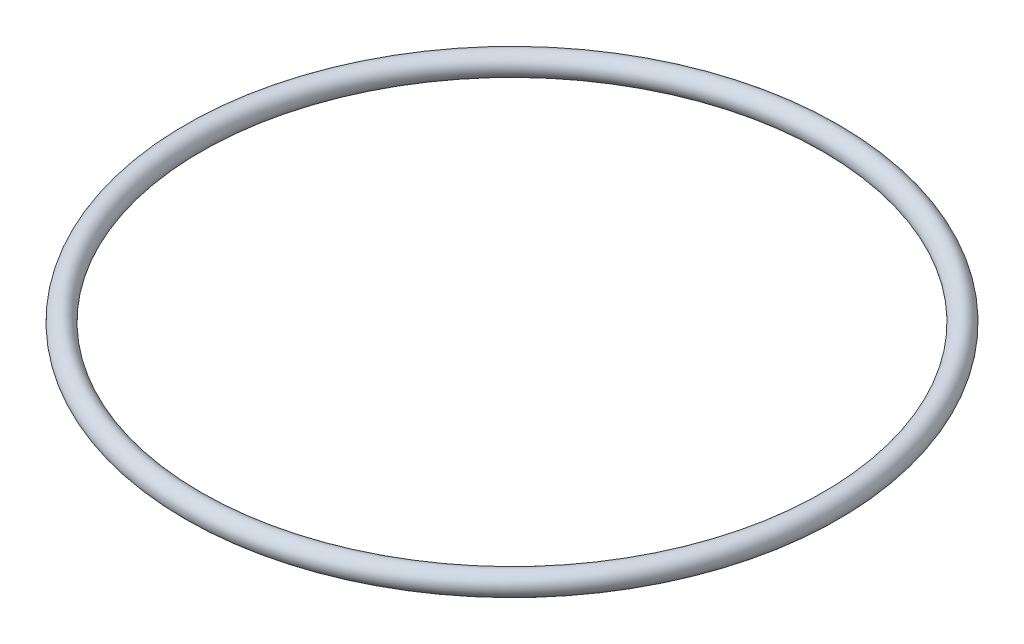
ISO-10303-21;
HEADER;
FILE_DESCRIPTION(('STEP AP214'),'2;1');
FILE_NAME('part.step','',(''),(''),'','','');
FILE_SCHEMA(('AUTOMOTIVE_DESIGN { 1 0 10303 214 1 1 1 1 }'));
ENDSEC;
DATA;
#1=APPLICATION_CONTEXT('core data for automotive mechanical design processes');
#2=APPLICATION_PROTOCOL_DEFINITION('international standard','automotive_design',2000,#1);
#3=PRODUCT_CONTEXT('',#1,'mechanical');
#4=PRODUCT('Part','Part','',(#3));
#5=PRODUCT_RELATED_PRODUCT_CATEGORY('part','',(#4));
#6=PRODUCT_DEFINITION_FORMATION('','',#4);
#7=PRODUCT_DEFINITION_CONTEXT('part definition',#1,'design');
#8=PRODUCT_DEFINITION('design','',#6,#7);
#9=PRODUCT_DEFINITION_SHAPE('','',#8);
#10=(LENGTH_UNIT() NAMED_UNIT(*) SI_UNIT(.MILLI.,.METRE.));
#11=(NAMED_UNIT(*) PLANE_ANGLE_UNIT() SI_UNIT($,.RADIAN.));
#12=(NAMED_UNIT(*) SI_UNIT($,.STERADIAN.) SOLID_ANGLE_UNIT());
#13=UNCERTAINTY_MEASURE_WITH_UNIT(LENGTH_MEASURE(1.E-05),#10,'distance_accuracy_value','');
#14=(GEOMETRIC_REPRESENTATION_CONTEXT(3) GLOBAL_UNCERTAINTY_ASSIGNED_CONTEXT((#13)) GLOBAL_UNIT_ASSIGNED_CONTEXT((#10,
#11,#12)) REPRESENTATION_CONTEXT('',''));
#15=CARTESIAN_POINT('',(0.,0.,0.));
#16=DIRECTION('',(0.,0.,1.));
#17=DIRECTION('',(1.,0.,0.));
#18=AXIS2_PLACEMENT_3D('',#15,#16,#17);
#19=CARTESIAN_POINT('',(0.,0.,0.));
#20=DIRECTION('',(0.,-1.,0.));
#21=DIRECTION('',(0.,0.,-1.));
#22=AXIS2_PLACEMENT_3D('',#19,#20,#21);
#23=TOROIDAL_SURFACE('',#22,46.0375,1.5875);
#24=CARTESIAN_POINT('',(0.,0.,-47.625));
#25=VERTEX_POINT('',#24);
#26=VERTEX_LOOP('',#25);
#27=FACE_BOUND('',#26,.T.);
#28=ADVANCED_FACE('F29',(#27),#23,.T.);
#29=CLOSED_SHELL('',(#28));
#30=MANIFOLD_SOLID_BREP('B2',#29);
#31=ADVANCED_BREP_SHAPE_REPRESENTATION('',(#18,#30),#14);
#32=SHAPE_DEFINITION_REPRESENTATION(#9,#31);
ENDSEC;
END-ISO-10303-21;
